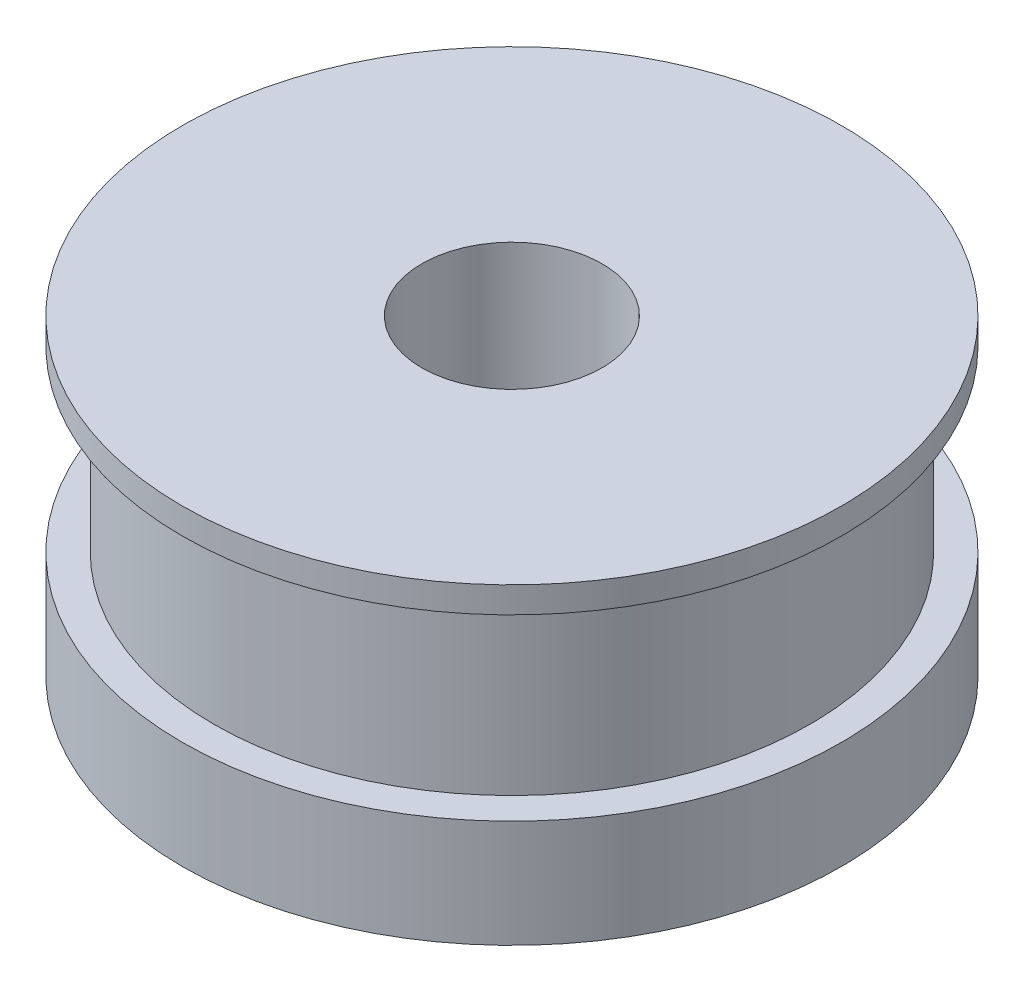
ISO-10303-21;
HEADER;
FILE_DESCRIPTION(('STEP AP214'),'2;1');
FILE_NAME('part.step','',(''),(''),'','','');
FILE_SCHEMA(('AUTOMOTIVE_DESIGN { 1 0 10303 214 1 1 1 1 }'));
ENDSEC;
DATA;
#1=APPLICATION_CONTEXT('core data for automotive mechanical design processes');
#2=APPLICATION_PROTOCOL_DEFINITION('international standard','automotive_design',2000,#1);
#3=PRODUCT_CONTEXT('',#1,'mechanical');
#4=PRODUCT('Part','Part','',(#3));
#5=PRODUCT_RELATED_PRODUCT_CATEGORY('part','',(#4));
#6=PRODUCT_DEFINITION_FORMATION('','',#4);
#7=PRODUCT_DEFINITION_CONTEXT('part definition',#1,'design');
#8=PRODUCT_DEFINITION('design','',#6,#7);
#9=PRODUCT_DEFINITION_SHAPE('','',#8);
#10=(LENGTH_UNIT() NAMED_UNIT(*) SI_UNIT(.MILLI.,.METRE.));
#11=(NAMED_UNIT(*) PLANE_ANGLE_UNIT() SI_UNIT($,.RADIAN.));
#12=(NAMED_UNIT(*) SI_UNIT($,.STERADIAN.) SOLID_ANGLE_UNIT());
#13=UNCERTAINTY_MEASURE_WITH_UNIT(LENGTH_MEASURE(1.E-05),#10,'distance_accuracy_value','');
#14=(GEOMETRIC_REPRESENTATION_CONTEXT(3) GLOBAL_UNCERTAINTY_ASSIGNED_CONTEXT((#13)) GLOBAL_UNIT_ASSIGNED_CONTEXT((#10,
#11,#12)) REPRESENTATION_CONTEXT('',''));
#15=CARTESIAN_POINT('',(0.,0.,0.));
#16=DIRECTION('',(0.,0.,1.));
#17=DIRECTION('',(1.,0.,0.));
#18=AXIS2_PLACEMENT_3D('',#15,#16,#17);
#19=CARTESIAN_POINT('',(0.,10.3155225102178,0.));
#20=DIRECTION('',(0.,1.,0.));
#21=DIRECTION('',(0.,0.,1.));
#22=AXIS2_PLACEMENT_3D('',#19,#20,#21);
#23=CYLINDRICAL_SURFACE('',#22,19.);
#24=CARTESIAN_POINT('',(0.,-5.15,0.));
#25=DIRECTION('',(0.,1.,0.));
#26=DIRECTION('',(0.,0.,1.));
#27=AXIS2_PLACEMENT_3D('',#24,#25,#26);
#28=CIRCLE('',#27,19.);
#29=CARTESIAN_POINT('',(0.,-5.15000000000001,19.));
#30=VERTEX_POINT('',#29);
#31=EDGE_CURVE('E94',#30,#30,#28,.T.);
#32=ORIENTED_EDGE('',*,*,#31,.F.);
#33=EDGE_LOOP('',(#32));
#34=FACE_BOUND('',#33,.T.);
#35=CARTESIAN_POINT('',(0.,-11.35,0.));
#36=DIRECTION('',(0.,1.,0.));
#37=DIRECTION('',(0.,0.,1.));
#38=AXIS2_PLACEMENT_3D('',#35,#36,#37);
#39=CIRCLE('',#38,19.);
#40=CARTESIAN_POINT('',(0.,-11.35,19.));
#41=VERTEX_POINT('',#40);
#42=EDGE_CURVE('E11',#41,#41,#39,.T.);
#43=ORIENTED_EDGE('',*,*,#42,.T.);
#44=EDGE_LOOP('',(#43));
#45=FACE_BOUND('',#44,.T.);
#46=ADVANCED_FACE('F41',(#34,#45),#23,.T.);
#47=CARTESIAN_POINT('',(0.,-11.35,-19.));
#48=DIRECTION('',(0.,1.,0.));
#49=DIRECTION('',(0.,0.,1.));
#50=AXIS2_PLACEMENT_3D('',#47,#48,#49);
#51=PLANE('',#50);
#52=CARTESIAN_POINT('',(0.,-11.35,8.));
#53=DIRECTION('',(0.,-1.,0.));
#54=DIRECTION('',(0.,0.,-1.));
#55=AXIS2_PLACEMENT_3D('',#52,#53,#54);
#56=CIRCLE('',#55,1.24999999999999);
#57=CARTESIAN_POINT('',(0.,-11.35,6.75000000000001));
#58=VERTEX_POINT('',#57);
#59=EDGE_CURVE('E72',#58,#58,#56,.T.);
#60=ORIENTED_EDGE('',*,*,#59,.F.);
#61=EDGE_LOOP('',(#60));
#62=FACE_BOUND('',#61,.T.);
#63=CARTESIAN_POINT('',(8.,-11.35,0.));
#64=DIRECTION('',(0.,-1.,0.));
#65=DIRECTION('',(0.,0.,-1.));
#66=AXIS2_PLACEMENT_3D('',#63,#64,#65);
#67=CIRCLE('',#66,1.24999999999999);
#68=CARTESIAN_POINT('',(8.,-11.35,-1.24999999999999));
#69=VERTEX_POINT('',#68);
#70=EDGE_CURVE('E71',#69,#69,#67,.T.);
#71=ORIENTED_EDGE('',*,*,#70,.F.);
#72=EDGE_LOOP('',(#71));
#73=FACE_BOUND('',#72,.T.);
#74=CARTESIAN_POINT('',(0.,-11.35,-8.));
#75=DIRECTION('',(0.,-1.,0.));
#76=DIRECTION('',(0.,0.,-1.));
#77=AXIS2_PLACEMENT_3D('',#74,#75,#76);
#78=CIRCLE('',#77,1.24999999999999);
#79=CARTESIAN_POINT('',(0.,-11.35,-9.24999999999999));
#80=VERTEX_POINT('',#79);
#81=EDGE_CURVE('E82',#80,#80,#78,.T.);
#82=ORIENTED_EDGE('',*,*,#81,.F.);
#83=EDGE_LOOP('',(#82));
#84=FACE_BOUND('',#83,.T.);
#85=CARTESIAN_POINT('',(-8.,-11.35,0.));
#86=DIRECTION('',(0.,-1.,0.));
#87=DIRECTION('',(0.,0.,-1.));
#88=AXIS2_PLACEMENT_3D('',#85,#86,#87);
#89=CIRCLE('',#88,1.24999999999999);
#90=CARTESIAN_POINT('',(-8.,-11.35,-1.24999999999999));
#91=VERTEX_POINT('',#90);
#92=EDGE_CURVE('E88',#91,#91,#89,.T.);
#93=ORIENTED_EDGE('',*,*,#92,.F.);
#94=EDGE_LOOP('',(#93));
#95=FACE_BOUND('',#94,.T.);
#96=ORIENTED_EDGE('',*,*,#42,.F.);
#97=EDGE_LOOP('',(#96));
#98=FACE_BOUND('',#97,.T.);
#99=CARTESIAN_POINT('',(0.,-11.35,0.));
#100=DIRECTION('',(0.,1.,0.));
#101=DIRECTION('',(0.,0.,1.));
#102=AXIS2_PLACEMENT_3D('',#99,#100,#101);
#103=CIRCLE('',#102,5.2);
#104=CARTESIAN_POINT('',(0.,-11.35,5.2));
#105=VERTEX_POINT('',#104);
#106=EDGE_CURVE('E48',#105,#105,#103,.T.);
#107=ORIENTED_EDGE('',*,*,#106,.T.);
#108=EDGE_LOOP('',(#107));
#109=FACE_BOUND('',#108,.T.);
#110=ADVANCED_FACE('F114',(#62,#73,#84,#95,#98,#109),#51,.F.);
#111=CARTESIAN_POINT('',(0.,10.3155225102178,0.));
#112=DIRECTION('',(0.,1.,0.));
#113=DIRECTION('',(0.,0.,1.));
#114=AXIS2_PLACEMENT_3D('',#111,#112,#113);
#115=CYLINDRICAL_SURFACE('',#114,5.2);
#116=ORIENTED_EDGE('',*,*,#106,.F.);
#117=EDGE_LOOP('',(#116));
#118=FACE_BOUND('',#117,.T.);
#119=CARTESIAN_POINT('',(0.,6.65,0.));
#120=DIRECTION('',(0.,1.,0.));
#121=DIRECTION('',(0.,0.,1.));
#122=AXIS2_PLACEMENT_3D('',#119,#120,#121);
#123=CIRCLE('',#122,5.2);
#124=CARTESIAN_POINT('',(0.,6.65,5.2));
#125=VERTEX_POINT('',#124);
#126=EDGE_CURVE('E109',#125,#125,#123,.T.);
#127=ORIENTED_EDGE('',*,*,#126,.T.);
#128=EDGE_LOOP('',(#127));
#129=FACE_BOUND('',#128,.T.);
#130=ADVANCED_FACE('F116',(#118,#129),#115,.F.);
#131=CARTESIAN_POINT('',(0.,6.65,-19.));
#132=DIRECTION('',(0.,-1.,0.));
#133=DIRECTION('',(0.,0.,-1.));
#134=AXIS2_PLACEMENT_3D('',#131,#132,#133);
#135=PLANE('',#134);
#136=ORIENTED_EDGE('',*,*,#126,.F.);
#137=EDGE_LOOP('',(#136));
#138=FACE_BOUND('',#137,.T.);
#139=CARTESIAN_POINT('',(0.,6.65,0.));
#140=DIRECTION('',(0.,1.,0.));
#141=DIRECTION('',(0.,0.,1.));
#142=AXIS2_PLACEMENT_3D('',#139,#140,#141);
#143=CIRCLE('',#142,19.);
#144=CARTESIAN_POINT('',(0.,6.64999999999999,19.));
#145=VERTEX_POINT('',#144);
#146=EDGE_CURVE('E106',#145,#145,#143,.T.);
#147=ORIENTED_EDGE('',*,*,#146,.T.);
#148=EDGE_LOOP('',(#147));
#149=FACE_BOUND('',#148,.T.);
#150=ADVANCED_FACE('F119',(#138,#149),#135,.F.);
#151=CARTESIAN_POINT('',(0.,10.3155225102178,0.));
#152=DIRECTION('',(0.,1.,0.));
#153=DIRECTION('',(0.,0.,1.));
#154=AXIS2_PLACEMENT_3D('',#151,#152,#153);
#155=CYLINDRICAL_SURFACE('',#154,19.);
#156=ORIENTED_EDGE('',*,*,#146,.F.);
#157=EDGE_LOOP('',(#156));
#158=FACE_BOUND('',#157,.T.);
#159=CARTESIAN_POINT('',(0.,5.15,0.));
#160=DIRECTION('',(0.,1.,0.));
#161=DIRECTION('',(0.,0.,1.));
#162=AXIS2_PLACEMENT_3D('',#159,#160,#161);
#163=CIRCLE('',#162,19.);
#164=CARTESIAN_POINT('',(0.,5.14999999999999,19.));
#165=VERTEX_POINT('',#164);
#166=EDGE_CURVE('E103',#165,#165,#163,.T.);
#167=ORIENTED_EDGE('',*,*,#166,.T.);
#168=EDGE_LOOP('',(#167));
#169=FACE_BOUND('',#168,.T.);
#170=ADVANCED_FACE('F125',(#158,#169),#155,.T.);
#171=CARTESIAN_POINT('',(0.,5.15,-17.19));
#172=DIRECTION('',(0.,1.,0.));
#173=DIRECTION('',(0.,0.,1.));
#174=AXIS2_PLACEMENT_3D('',#171,#172,#173);
#175=PLANE('',#174);
#176=ORIENTED_EDGE('',*,*,#166,.F.);
#177=EDGE_LOOP('',(#176));
#178=FACE_BOUND('',#177,.T.);
#179=CARTESIAN_POINT('',(0.,5.15,0.));
#180=DIRECTION('',(0.,1.,0.));
#181=DIRECTION('',(0.,0.,1.));
#182=AXIS2_PLACEMENT_3D('',#179,#180,#181);
#183=CIRCLE('',#182,17.19);
#184=CARTESIAN_POINT('',(0.,5.15,17.19));
#185=VERTEX_POINT('',#184);
#186=EDGE_CURVE('E100',#185,#185,#183,.T.);
#187=ORIENTED_EDGE('',*,*,#186,.T.);
#188=EDGE_LOOP('',(#187));
#189=FACE_BOUND('',#188,.T.);
#190=ADVANCED_FACE('F131',(#178,#189),#175,.F.);
#191=CARTESIAN_POINT('',(0.,10.3155225102178,0.));
#192=DIRECTION('',(0.,1.,0.));
#193=DIRECTION('',(0.,0.,1.));
#194=AXIS2_PLACEMENT_3D('',#191,#192,#193);
#195=CYLINDRICAL_SURFACE('',#194,17.19);
#196=ORIENTED_EDGE('',*,*,#186,.F.);
#197=EDGE_LOOP('',(#196));
#198=FACE_BOUND('',#197,.T.);
#199=CARTESIAN_POINT('',(0.,-5.15,0.));
#200=DIRECTION('',(0.,1.,0.));
#201=DIRECTION('',(0.,0.,1.));
#202=AXIS2_PLACEMENT_3D('',#199,#200,#201);
#203=CIRCLE('',#202,17.19);
#204=CARTESIAN_POINT('',(0.,-5.15000000000001,17.19));
#205=VERTEX_POINT('',#204);
#206=EDGE_CURVE('E97',#205,#205,#203,.T.);
#207=ORIENTED_EDGE('',*,*,#206,.T.);
#208=EDGE_LOOP('',(#207));
#209=FACE_BOUND('',#208,.T.);
#210=ADVANCED_FACE('F137',(#198,#209),#195,.T.);
#211=CARTESIAN_POINT('',(0.,-5.15,-17.19));
#212=DIRECTION('',(0.,-1.,0.));
#213=DIRECTION('',(0.,0.,-1.));
#214=AXIS2_PLACEMENT_3D('',#211,#212,#213);
#215=PLANE('',#214);
#216=ORIENTED_EDGE('',*,*,#206,.F.);
#217=EDGE_LOOP('',(#216));
#218=FACE_BOUND('',#217,.T.);
#219=ORIENTED_EDGE('',*,*,#31,.T.);
#220=EDGE_LOOP('',(#219));
#221=FACE_BOUND('',#220,.T.);
#222=ADVANCED_FACE('F143',(#218,#221),#215,.F.);
#223=CARTESIAN_POINT('',(-8.,-7.35,0.));
#224=DIRECTION('',(0.,-1.,0.));
#225=DIRECTION('',(0.,0.,-1.));
#226=AXIS2_PLACEMENT_3D('',#223,#224,#225);
#227=CONICAL_SURFACE('',#226,1.25,1.02974425867665);
#228=CARTESIAN_POINT('',(-8.,-6.59892422621555,0.));
#229=VERTEX_POINT('',#228);
#230=VERTEX_LOOP('',#229);
#231=FACE_BOUND('',#230,.T.);
#232=CARTESIAN_POINT('',(-8.,-7.35,0.));
#233=DIRECTION('',(0.,-1.,0.));
#234=DIRECTION('',(0.,0.,-1.));
#235=AXIS2_PLACEMENT_3D('',#232,#233,#234);
#236=CIRCLE('',#235,1.25);
#237=CARTESIAN_POINT('',(-8.,-7.35,-1.25));
#238=VERTEX_POINT('',#237);
#239=EDGE_CURVE('E91',#238,#238,#236,.T.);
#240=ORIENTED_EDGE('',*,*,#239,.T.);
#241=EDGE_LOOP('',(#240));
#242=FACE_BOUND('',#241,.T.);
#243=ADVANCED_FACE('F149',(#231,#242),#227,.F.);
#244=CARTESIAN_POINT('',(-8.,-11.35,0.));
#245=DIRECTION('',(0.,-1.,0.));
#246=DIRECTION('',(0.,0.,-1.));
#247=AXIS2_PLACEMENT_3D('',#244,#245,#246);
#248=CYLINDRICAL_SURFACE('',#247,1.24999999999999);
#249=ORIENTED_EDGE('',*,*,#239,.F.);
#250=EDGE_LOOP('',(#249));
#251=FACE_BOUND('',#250,.T.);
#252=ORIENTED_EDGE('',*,*,#92,.T.);
#253=EDGE_LOOP('',(#252));
#254=FACE_BOUND('',#253,.T.);
#255=ADVANCED_FACE('F166',(#251,#254),#248,.F.);
#256=CARTESIAN_POINT('',(0.,-7.35,-8.));
#257=DIRECTION('',(0.,-1.,0.));
#258=DIRECTION('',(0.,0.,-1.));
#259=AXIS2_PLACEMENT_3D('',#256,#257,#258);
#260=CONICAL_SURFACE('',#259,1.25,1.02974425867665);
#261=CARTESIAN_POINT('',(0.,-6.59892422621555,-8.));
#262=VERTEX_POINT('',#261);
#263=VERTEX_LOOP('',#262);
#264=FACE_BOUND('',#263,.T.);
#265=CARTESIAN_POINT('',(0.,-7.35,-8.));
#266=DIRECTION('',(0.,-1.,0.));
#267=DIRECTION('',(0.,0.,-1.));
#268=AXIS2_PLACEMENT_3D('',#265,#266,#267);
#269=CIRCLE('',#268,1.25);
#270=CARTESIAN_POINT('',(0.,-7.35,-9.25));
#271=VERTEX_POINT('',#270);
#272=EDGE_CURVE('E85',#271,#271,#269,.T.);
#273=ORIENTED_EDGE('',*,*,#272,.T.);
#274=EDGE_LOOP('',(#273));
#275=FACE_BOUND('',#274,.T.);
#276=ADVANCED_FACE('F169',(#264,#275),#260,.F.);
#277=CARTESIAN_POINT('',(0.,-11.35,-8.));
#278=DIRECTION('',(0.,-1.,0.));
#279=DIRECTION('',(0.,0.,-1.));
#280=AXIS2_PLACEMENT_3D('',#277,#278,#279);
#281=CYLINDRICAL_SURFACE('',#280,1.24999999999999);
#282=ORIENTED_EDGE('',*,*,#272,.F.);
#283=EDGE_LOOP('',(#282));
#284=FACE_BOUND('',#283,.T.);
#285=ORIENTED_EDGE('',*,*,#81,.T.);
#286=EDGE_LOOP('',(#285));
#287=FACE_BOUND('',#286,.T.);
#288=ADVANCED_FACE('F173',(#284,#287),#281,.F.);
#289=CARTESIAN_POINT('',(8.,-7.35,0.));
#290=DIRECTION('',(0.,-1.,0.));
#291=DIRECTION('',(0.,0.,-1.));
#292=AXIS2_PLACEMENT_3D('',#289,#290,#291);
#293=CONICAL_SURFACE('',#292,1.25,1.02974425867665);
#294=CARTESIAN_POINT('',(8.,-6.59892422621555,0.));
#295=VERTEX_POINT('',#294);
#296=VERTEX_LOOP('',#295);
#297=FACE_BOUND('',#296,.T.);
#298=CARTESIAN_POINT('',(8.,-7.35,0.));
#299=DIRECTION('',(0.,-1.,0.));
#300=DIRECTION('',(0.,0.,-1.));
#301=AXIS2_PLACEMENT_3D('',#298,#299,#300);
#302=CIRCLE('',#301,1.25);
#303=CARTESIAN_POINT('',(8.,-7.35,-1.25));
#304=VERTEX_POINT('',#303);
#305=EDGE_CURVE('E75',#304,#304,#302,.T.);
#306=ORIENTED_EDGE('',*,*,#305,.T.);
#307=EDGE_LOOP('',(#306));
#308=FACE_BOUND('',#307,.T.);
#309=ADVANCED_FACE('F176',(#297,#308),#293,.F.);
#310=CARTESIAN_POINT('',(8.,-11.35,0.));
#311=DIRECTION('',(0.,-1.,0.));
#312=DIRECTION('',(0.,0.,-1.));
#313=AXIS2_PLACEMENT_3D('',#310,#311,#312);
#314=CYLINDRICAL_SURFACE('',#313,1.24999999999999);
#315=ORIENTED_EDGE('',*,*,#305,.F.);
#316=EDGE_LOOP('',(#315));
#317=FACE_BOUND('',#316,.T.);
#318=ORIENTED_EDGE('',*,*,#70,.T.);
#319=EDGE_LOOP('',(#318));
#320=FACE_BOUND('',#319,.T.);
#321=ADVANCED_FACE('F65',(#317,#320),#314,.F.);
#322=CARTESIAN_POINT('',(0.,-7.35,8.));
#323=DIRECTION('',(0.,-1.,0.));
#324=DIRECTION('',(0.,0.,-1.));
#325=AXIS2_PLACEMENT_3D('',#322,#323,#324);
#326=CONICAL_SURFACE('',#325,1.25,1.02974425867665);
#327=CARTESIAN_POINT('',(0.,-6.59892422621555,8.));
#328=VERTEX_POINT('',#327);
#329=VERTEX_LOOP('',#328);
#330=FACE_BOUND('',#329,.T.);
#331=CARTESIAN_POINT('',(0.,-7.35,8.));
#332=DIRECTION('',(0.,-1.,0.));
#333=DIRECTION('',(0.,0.,-1.));
#334=AXIS2_PLACEMENT_3D('',#331,#332,#333);
#335=CIRCLE('',#334,1.25);
#336=CARTESIAN_POINT('',(0.,-7.35,6.75));
#337=VERTEX_POINT('',#336);
#338=EDGE_CURVE('E69',#337,#337,#335,.T.);
#339=ORIENTED_EDGE('',*,*,#338,.T.);
#340=EDGE_LOOP('',(#339));
#341=FACE_BOUND('',#340,.T.);
#342=ADVANCED_FACE('F61',(#330,#341),#326,.F.);
#343=CARTESIAN_POINT('',(0.,-11.35,8.));
#344=DIRECTION('',(0.,-1.,0.));
#345=DIRECTION('',(0.,0.,-1.));
#346=AXIS2_PLACEMENT_3D('',#343,#344,#345);
#347=CYLINDRICAL_SURFACE('',#346,1.24999999999999);
#348=ORIENTED_EDGE('',*,*,#338,.F.);
#349=EDGE_LOOP('',(#348));
#350=FACE_BOUND('',#349,.T.);
#351=ORIENTED_EDGE('',*,*,#59,.T.);
#352=EDGE_LOOP('',(#351));
#353=FACE_BOUND('',#352,.T.);
#354=ADVANCED_FACE('F64',(#350,#353),#347,.F.);
#355=CLOSED_SHELL('',(#46,#110,#130,#150,#170,#190,#210,#222,#243,#255,#276,#288,#309,#321,#342,#354));
#356=MANIFOLD_SOLID_BREP('B2',#355);
#357=ADVANCED_BREP_SHAPE_REPRESENTATION('',(#18,#356),#14);
#358=SHAPE_DEFINITION_REPRESENTATION(#9,#357);
ENDSEC;
END-ISO-10303-21;
